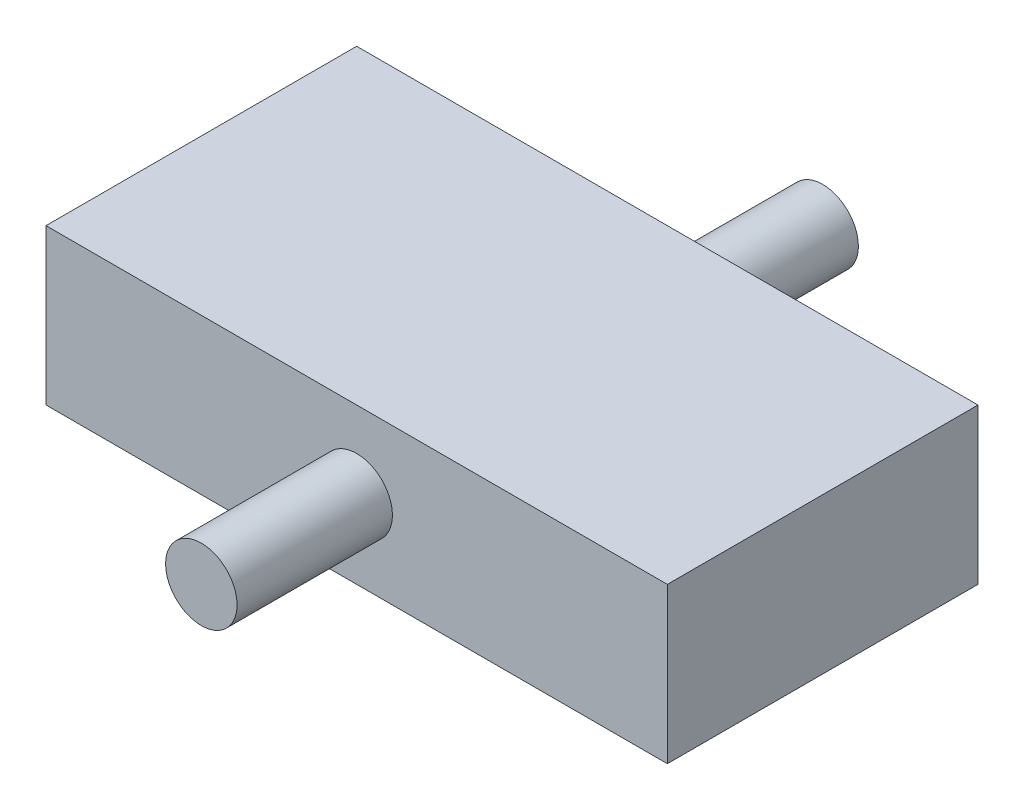
ISO-10303-21;
HEADER;
FILE_DESCRIPTION(('STEP AP214'),'2;1');
FILE_NAME('part.step','',(''),(''),'','','');
FILE_SCHEMA(('AUTOMOTIVE_DESIGN { 1 0 10303 214 1 1 1 1 }'));
ENDSEC;
DATA;
#1=APPLICATION_CONTEXT('core data for automotive mechanical design processes');
#2=APPLICATION_PROTOCOL_DEFINITION('international standard','automotive_design',2000,#1);
#3=PRODUCT_CONTEXT('',#1,'mechanical');
#4=PRODUCT('Part','Part','',(#3));
#5=PRODUCT_RELATED_PRODUCT_CATEGORY('part','',(#4));
#6=PRODUCT_DEFINITION_FORMATION('','',#4);
#7=PRODUCT_DEFINITION_CONTEXT('part definition',#1,'design');
#8=PRODUCT_DEFINITION('design','',#6,#7);
#9=PRODUCT_DEFINITION_SHAPE('','',#8);
#10=(LENGTH_UNIT() NAMED_UNIT(*) SI_UNIT(.MILLI.,.METRE.));
#11=(NAMED_UNIT(*) PLANE_ANGLE_UNIT() SI_UNIT($,.RADIAN.));
#12=(NAMED_UNIT(*) SI_UNIT($,.STERADIAN.) SOLID_ANGLE_UNIT());
#13=UNCERTAINTY_MEASURE_WITH_UNIT(LENGTH_MEASURE(1.E-05),#10,'distance_accuracy_value','');
#14=(GEOMETRIC_REPRESENTATION_CONTEXT(3) GLOBAL_UNCERTAINTY_ASSIGNED_CONTEXT((#13)) GLOBAL_UNIT_ASSIGNED_CONTEXT((#10,
#11,#12)) REPRESENTATION_CONTEXT('',''));
#15=CARTESIAN_POINT('',(0.,0.,0.));
#16=DIRECTION('',(0.,0.,1.));
#17=DIRECTION('',(1.,0.,0.));
#18=AXIS2_PLACEMENT_3D('',#15,#16,#17);
#19=CARTESIAN_POINT('',(50.8,25.4,25.4));
#20=DIRECTION('',(-1.,0.,0.));
#21=DIRECTION('',(0.,0.,1.));
#22=AXIS2_PLACEMENT_3D('',#19,#20,#21);
#23=PLANE('',#22);
#24=DIRECTION('',(0.,0.,-1.));
#25=VECTOR('',#24,1.);
#26=CARTESIAN_POINT('',(50.8,0.,25.4));
#27=LINE('',#26,#25);
#28=CARTESIAN_POINT('',(50.8,0.,25.4));
#29=VERTEX_POINT('',#28);
#30=CARTESIAN_POINT('',(50.8,0.,-25.4));
#31=VERTEX_POINT('',#30);
#32=EDGE_CURVE('E116',#29,#31,#27,.T.);
#33=ORIENTED_EDGE('',*,*,#32,.T.);
#34=DIRECTION('',(0.,-1.,0.));
#35=VECTOR('',#34,1.);
#36=CARTESIAN_POINT('',(50.8,25.4,-25.4));
#37=LINE('',#36,#35);
#38=CARTESIAN_POINT('',(50.8,25.4,-25.4));
#39=VERTEX_POINT('',#38);
#40=EDGE_CURVE('E54',#39,#31,#37,.T.);
#41=ORIENTED_EDGE('',*,*,#40,.F.);
#42=DIRECTION('',(0.,0.,-1.));
#43=VECTOR('',#42,1.);
#44=CARTESIAN_POINT('',(50.8,25.4,25.4));
#45=LINE('',#44,#43);
#46=CARTESIAN_POINT('',(50.8,25.4,25.4));
#47=VERTEX_POINT('',#46);
#48=EDGE_CURVE('E98',#47,#39,#45,.T.);
#49=ORIENTED_EDGE('',*,*,#48,.F.);
#50=DIRECTION('',(0.,-1.,0.));
#51=VECTOR('',#50,1.);
#52=CARTESIAN_POINT('',(50.8,25.4,25.4));
#53=LINE('',#52,#51);
#54=EDGE_CURVE('E112',#47,#29,#53,.T.);
#55=ORIENTED_EDGE('',*,*,#54,.T.);
#56=EDGE_LOOP('',(#33,#41,#49,#55));
#57=FACE_BOUND('',#56,.T.);
#58=ADVANCED_FACE('F45',(#57),#23,.F.);
#59=CARTESIAN_POINT('',(-50.8,25.4,-25.4));
#60=DIRECTION('',(0.,0.,1.));
#61=DIRECTION('',(1.,0.,0.));
#62=AXIS2_PLACEMENT_3D('',#59,#60,#61);
#63=PLANE('',#62);
#64=CARTESIAN_POINT('',(0.,12.7,-25.4));
#65=DIRECTION('',(0.,0.,1.));
#66=DIRECTION('',(1.,0.,0.));
#67=AXIS2_PLACEMENT_3D('',#64,#65,#66);
#68=CIRCLE('',#67,5.842);
#69=CARTESIAN_POINT('',(5.842,12.7,-25.4));
#70=VERTEX_POINT('',#69);
#71=EDGE_CURVE('E207',#70,#70,#68,.T.);
#72=ORIENTED_EDGE('',*,*,#71,.T.);
#73=EDGE_LOOP('',(#72));
#74=FACE_BOUND('',#73,.T.);
#75=DIRECTION('',(-1.,0.,0.));
#76=VECTOR('',#75,1.);
#77=CARTESIAN_POINT('',(-50.8,0.,-25.4));
#78=LINE('',#77,#76);
#79=CARTESIAN_POINT('',(-50.8,0.,-25.4));
#80=VERTEX_POINT('',#79);
#81=EDGE_CURVE('E104',#31,#80,#78,.T.);
#82=ORIENTED_EDGE('',*,*,#81,.T.);
#83=DIRECTION('',(0.,-1.,0.));
#84=VECTOR('',#83,1.);
#85=CARTESIAN_POINT('',(-50.8,25.4,-25.4));
#86=LINE('',#85,#84);
#87=CARTESIAN_POINT('',(-50.8,25.4,-25.4));
#88=VERTEX_POINT('',#87);
#89=EDGE_CURVE('E102',#88,#80,#86,.T.);
#90=ORIENTED_EDGE('',*,*,#89,.F.);
#91=DIRECTION('',(-1.,0.,0.));
#92=VECTOR('',#91,1.);
#93=CARTESIAN_POINT('',(-50.8,25.4,-25.4));
#94=LINE('',#93,#92);
#95=EDGE_CURVE('E93',#39,#88,#94,.T.);
#96=ORIENTED_EDGE('',*,*,#95,.F.);
#97=ORIENTED_EDGE('',*,*,#40,.T.);
#98=EDGE_LOOP('',(#82,#90,#96,#97));
#99=FACE_BOUND('',#98,.T.);
#100=ADVANCED_FACE('F103',(#74,#99),#63,.F.);
#101=CARTESIAN_POINT('',(-50.8,25.4,25.4));
#102=DIRECTION('',(1.,0.,0.));
#103=DIRECTION('',(0.,0.,-1.));
#104=AXIS2_PLACEMENT_3D('',#101,#102,#103);
#105=PLANE('',#104);
#106=DIRECTION('',(0.,0.,1.));
#107=VECTOR('',#106,1.);
#108=CARTESIAN_POINT('',(-50.8,0.,25.4));
#109=LINE('',#108,#107);
#110=CARTESIAN_POINT('',(-50.8,0.,25.4));
#111=VERTEX_POINT('',#110);
#112=EDGE_CURVE('E79',#80,#111,#109,.T.);
#113=ORIENTED_EDGE('',*,*,#112,.T.);
#114=DIRECTION('',(0.,-1.,0.));
#115=VECTOR('',#114,1.);
#116=CARTESIAN_POINT('',(-50.8,25.4,25.4));
#117=LINE('',#116,#115);
#118=CARTESIAN_POINT('',(-50.8,25.4,25.4));
#119=VERTEX_POINT('',#118);
#120=EDGE_CURVE('E106',#119,#111,#117,.T.);
#121=ORIENTED_EDGE('',*,*,#120,.F.);
#122=DIRECTION('',(0.,0.,1.));
#123=VECTOR('',#122,1.);
#124=CARTESIAN_POINT('',(-50.8,25.4,25.4));
#125=LINE('',#124,#123);
#126=EDGE_CURVE('E96',#88,#119,#125,.T.);
#127=ORIENTED_EDGE('',*,*,#126,.F.);
#128=ORIENTED_EDGE('',*,*,#89,.T.);
#129=EDGE_LOOP('',(#113,#121,#127,#128));
#130=FACE_BOUND('',#129,.T.);
#131=ADVANCED_FACE('F108',(#130),#105,.F.);
#132=CARTESIAN_POINT('',(-50.8,25.4,25.4));
#133=DIRECTION('',(0.,0.,-1.));
#134=DIRECTION('',(-1.,0.,0.));
#135=AXIS2_PLACEMENT_3D('',#132,#133,#134);
#136=PLANE('',#135);
#137=CARTESIAN_POINT('',(0.,12.7,25.4));
#138=DIRECTION('',(0.,0.,-1.));
#139=DIRECTION('',(-1.,0.,0.));
#140=AXIS2_PLACEMENT_3D('',#137,#138,#139);
#141=CIRCLE('',#140,5.842);
#142=CARTESIAN_POINT('',(-5.842,12.7,25.4));
#143=VERTEX_POINT('',#142);
#144=EDGE_CURVE('E11',#143,#143,#141,.F.);
#145=ORIENTED_EDGE('',*,*,#144,.F.);
#146=EDGE_LOOP('',(#145));
#147=FACE_BOUND('',#146,.T.);
#148=DIRECTION('',(1.,0.,0.));
#149=VECTOR('',#148,1.);
#150=CARTESIAN_POINT('',(-50.8,0.,25.4));
#151=LINE('',#150,#149);
#152=EDGE_CURVE('E85',#111,#29,#151,.T.);
#153=ORIENTED_EDGE('',*,*,#152,.T.);
#154=ORIENTED_EDGE('',*,*,#54,.F.);
#155=DIRECTION('',(1.,0.,0.));
#156=VECTOR('',#155,1.);
#157=CARTESIAN_POINT('',(-50.8,25.4,25.4));
#158=LINE('',#157,#156);
#159=EDGE_CURVE('E62',#119,#47,#158,.T.);
#160=ORIENTED_EDGE('',*,*,#159,.F.);
#161=ORIENTED_EDGE('',*,*,#120,.T.);
#162=EDGE_LOOP('',(#153,#154,#160,#161));
#163=FACE_BOUND('',#162,.T.);
#164=ADVANCED_FACE('F146',(#147,#163),#136,.F.);
#165=CARTESIAN_POINT('',(0.,25.4,0.));
#166=DIRECTION('',(0.,-1.,0.));
#167=DIRECTION('',(0.,0.,-1.));
#168=AXIS2_PLACEMENT_3D('',#165,#166,#167);
#169=PLANE('',#168);
#170=ORIENTED_EDGE('',*,*,#48,.T.);
#171=ORIENTED_EDGE('',*,*,#95,.T.);
#172=ORIENTED_EDGE('',*,*,#126,.T.);
#173=ORIENTED_EDGE('',*,*,#159,.T.);
#174=EDGE_LOOP('',(#170,#171,#172,#173));
#175=FACE_BOUND('',#174,.T.);
#176=ADVANCED_FACE('F94',(#175),#169,.F.);
#177=CARTESIAN_POINT('',(0.,0.,0.));
#178=DIRECTION('',(0.,-1.,0.));
#179=DIRECTION('',(0.,0.,-1.));
#180=AXIS2_PLACEMENT_3D('',#177,#178,#179);
#181=PLANE('',#180);
#182=ORIENTED_EDGE('',*,*,#32,.F.);
#183=ORIENTED_EDGE('',*,*,#152,.F.);
#184=ORIENTED_EDGE('',*,*,#112,.F.);
#185=ORIENTED_EDGE('',*,*,#81,.F.);
#186=EDGE_LOOP('',(#182,#183,#184,#185));
#187=FACE_BOUND('',#186,.T.);
#188=ADVANCED_FACE('F134',(#187),#181,.T.);
#189=CARTESIAN_POINT('',(0.,12.7,50.8));
#190=DIRECTION('',(0.,0.,-1.));
#191=DIRECTION('',(-1.,0.,0.));
#192=AXIS2_PLACEMENT_3D('',#189,#190,#191);
#193=CYLINDRICAL_SURFACE('',#192,5.842);
#194=CARTESIAN_POINT('',(0.,12.7,50.8));
#195=DIRECTION('',(0.,0.,1.));
#196=DIRECTION('',(1.,0.,0.));
#197=AXIS2_PLACEMENT_3D('',#194,#195,#196);
#198=CIRCLE('',#197,5.842);
#199=CARTESIAN_POINT('',(5.842,12.7,50.8));
#200=VERTEX_POINT('',#199);
#201=EDGE_CURVE('E120',#200,#200,#198,.T.);
#202=ORIENTED_EDGE('',*,*,#201,.F.);
#203=EDGE_LOOP('',(#202));
#204=FACE_BOUND('',#203,.T.);
#205=ORIENTED_EDGE('',*,*,#144,.T.);
#206=EDGE_LOOP('',(#205));
#207=FACE_BOUND('',#206,.T.);
#208=ADVANCED_FACE('F136',(#204,#207),#193,.T.);
#209=CARTESIAN_POINT('',(0.,12.7,50.8));
#210=DIRECTION('',(0.,0.,1.));
#211=DIRECTION('',(1.,0.,0.));
#212=AXIS2_PLACEMENT_3D('',#209,#210,#211);
#213=PLANE('',#212);
#214=ORIENTED_EDGE('',*,*,#201,.T.);
#215=EDGE_LOOP('',(#214));
#216=FACE_BOUND('',#215,.T.);
#217=ADVANCED_FACE('F143',(#216),#213,.T.);
#218=CARTESIAN_POINT('',(0.,12.7,-50.8));
#219=DIRECTION('',(0.,0.,1.));
#220=DIRECTION('',(1.,0.,0.));
#221=AXIS2_PLACEMENT_3D('',#218,#219,#220);
#222=CYLINDRICAL_SURFACE('',#221,5.842);
#223=CARTESIAN_POINT('',(0.,12.7,-50.8));
#224=DIRECTION('',(0.,0.,1.));
#225=DIRECTION('',(1.,0.,0.));
#226=AXIS2_PLACEMENT_3D('',#223,#224,#225);
#227=CIRCLE('',#226,5.842);
#228=CARTESIAN_POINT('',(5.842,12.7,-50.8));
#229=VERTEX_POINT('',#228);
#230=EDGE_CURVE('E205',#229,#229,#227,.T.);
#231=ORIENTED_EDGE('',*,*,#230,.T.);
#232=EDGE_LOOP('',(#231));
#233=FACE_BOUND('',#232,.T.);
#234=ORIENTED_EDGE('',*,*,#71,.F.);
#235=EDGE_LOOP('',(#234));
#236=FACE_BOUND('',#235,.T.);
#237=ADVANCED_FACE('F178',(#233,#236),#222,.T.);
#238=CARTESIAN_POINT('',(0.,12.7,-50.8));
#239=DIRECTION('',(0.,0.,-1.));
#240=DIRECTION('',(1.,0.,0.));
#241=AXIS2_PLACEMENT_3D('',#238,#239,#240);
#242=PLANE('',#241);
#243=ORIENTED_EDGE('',*,*,#230,.F.);
#244=EDGE_LOOP('',(#243));
#245=FACE_BOUND('',#244,.T.);
#246=ADVANCED_FACE('F190',(#245),#242,.T.);
#247=CLOSED_SHELL('',(#58,#100,#131,#164,#176,#188,#208,#217,#237,#246));
#248=MANIFOLD_SOLID_BREP('B2',#247);
#249=ADVANCED_BREP_SHAPE_REPRESENTATION('',(#18,#248),#14);
#250=SHAPE_DEFINITION_REPRESENTATION(#9,#249);
ENDSEC;
END-ISO-10303-21;
